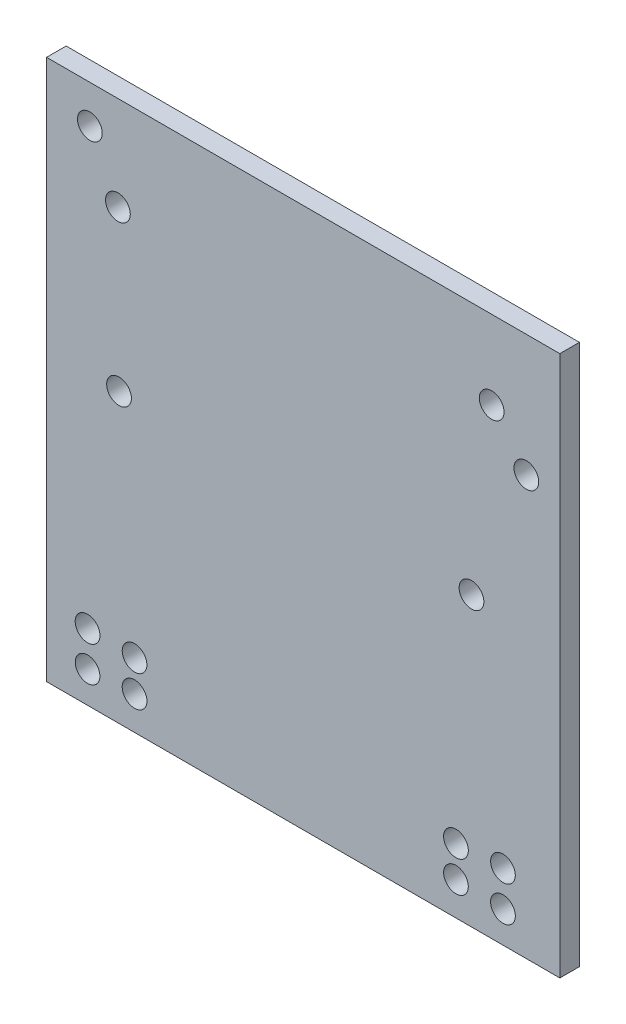
ISO-10303-21;
HEADER;
FILE_DESCRIPTION(('STEP AP214'),'2;1');
FILE_NAME('part.step','',(''),(''),'','','');
FILE_SCHEMA(('AUTOMOTIVE_DESIGN { 1 0 10303 214 1 1 1 1 }'));
ENDSEC;
DATA;
#1=APPLICATION_CONTEXT('core data for automotive mechanical design processes');
#2=APPLICATION_PROTOCOL_DEFINITION('international standard','automotive_design',2000,#1);
#3=PRODUCT_CONTEXT('',#1,'mechanical');
#4=PRODUCT('Part','Part','',(#3));
#5=PRODUCT_RELATED_PRODUCT_CATEGORY('part','',(#4));
#6=PRODUCT_DEFINITION_FORMATION('','',#4);
#7=PRODUCT_DEFINITION_CONTEXT('part definition',#1,'design');
#8=PRODUCT_DEFINITION('design','',#6,#7);
#9=PRODUCT_DEFINITION_SHAPE('','',#8);
#10=(LENGTH_UNIT() NAMED_UNIT(*) SI_UNIT(.MILLI.,.METRE.));
#11=(NAMED_UNIT(*) PLANE_ANGLE_UNIT() SI_UNIT($,.RADIAN.));
#12=(NAMED_UNIT(*) SI_UNIT($,.STERADIAN.) SOLID_ANGLE_UNIT());
#13=UNCERTAINTY_MEASURE_WITH_UNIT(LENGTH_MEASURE(1.E-05),#10,'distance_accuracy_value','');
#14=(GEOMETRIC_REPRESENTATION_CONTEXT(3) GLOBAL_UNCERTAINTY_ASSIGNED_CONTEXT((#13)) GLOBAL_UNIT_ASSIGNED_CONTEXT((#10,
#11,#12)) REPRESENTATION_CONTEXT('',''));
#15=CARTESIAN_POINT('',(0.,0.,0.));
#16=DIRECTION('',(0.,0.,1.));
#17=DIRECTION('',(1.,0.,0.));
#18=AXIS2_PLACEMENT_3D('',#15,#16,#17);
#19=CARTESIAN_POINT('',(0.,0.,-6.35));
#20=DIRECTION('',(0.,0.,1.));
#21=DIRECTION('',(-1.,0.,0.));
#22=AXIS2_PLACEMENT_3D('',#19,#20,#21);
#23=PLANE('',#22);
#24=CARTESIAN_POINT('',(-682.865800723062,218.063265585835,-6.35));
#25=DIRECTION('',(0.,0.,1.));
#26=DIRECTION('',(1.,0.,0.));
#27=AXIS2_PLACEMENT_3D('',#24,#25,#26);
#28=CIRCLE('',#27,4.00100000000008);
#29=CARTESIAN_POINT('',(-678.864800723062,218.063265585835,-6.35));
#30=VERTEX_POINT('',#29);
#31=EDGE_CURVE('E176',#30,#30,#28,.T.);
#32=ORIENTED_EDGE('',*,*,#31,.T.);
#33=EDGE_LOOP('',(#32));
#34=FACE_BOUND('',#33,.T.);
#35=CARTESIAN_POINT('',(-667.625800723062,228.858265585835,-6.35));
#36=DIRECTION('',(0.,0.,1.));
#37=DIRECTION('',(1.,0.,0.));
#38=AXIS2_PLACEMENT_3D('',#35,#36,#37);
#39=CIRCLE('',#38,4.00100000000008);
#40=CARTESIAN_POINT('',(-663.624800723062,228.858265585835,-6.35));
#41=VERTEX_POINT('',#40);
#42=EDGE_CURVE('E191',#41,#41,#39,.T.);
#43=ORIENTED_EDGE('',*,*,#42,.T.);
#44=EDGE_LOOP('',(#43));
#45=FACE_BOUND('',#44,.T.);
#46=CARTESIAN_POINT('',(-563.396926739587,218.698265585841,-6.35));
#47=DIRECTION('',(0.,0.,1.));
#48=DIRECTION('',(1.,0.,0.));
#49=AXIS2_PLACEMENT_3D('',#46,#47,#48);
#50=CIRCLE('',#49,4.00100000000008);
#51=CARTESIAN_POINT('',(-559.395926739586,218.698265585841,-6.35));
#52=VERTEX_POINT('',#51);
#53=EDGE_CURVE('E185',#52,#52,#50,.T.);
#54=ORIENTED_EDGE('',*,*,#53,.T.);
#55=EDGE_LOOP('',(#54));
#56=FACE_BOUND('',#55,.T.);
#57=CARTESIAN_POINT('',(-548.156926739587,229.493265585841,-6.35));
#58=DIRECTION('',(0.,0.,1.));
#59=DIRECTION('',(1.,0.,0.));
#60=AXIS2_PLACEMENT_3D('',#57,#58,#59);
#61=CIRCLE('',#60,4.00100000000008);
#62=CARTESIAN_POINT('',(-544.155926739586,229.493265585841,-6.35));
#63=VERTEX_POINT('',#62);
#64=EDGE_CURVE('E179',#63,#63,#61,.T.);
#65=ORIENTED_EDGE('',*,*,#64,.T.);
#66=EDGE_LOOP('',(#65));
#67=FACE_BOUND('',#66,.T.);
#68=DIRECTION('',(0.,1.,0.));
#69=VECTOR('',#68,1.);
#70=CARTESIAN_POINT('',(-529.711216697131,207.903265585856,-6.35));
#71=LINE('',#70,#69);
#72=CARTESIAN_POINT('',(-529.711216697131,207.903265585856,-6.35));
#73=VERTEX_POINT('',#72);
#74=CARTESIAN_POINT('',(-529.711216697131,383.2533201506,-6.35));
#75=VERTEX_POINT('',#74);
#76=EDGE_CURVE('E99',#73,#75,#71,.T.);
#77=ORIENTED_EDGE('',*,*,#76,.F.);
#78=DIRECTION('',(1.,0.,0.));
#79=VECTOR('',#78,1.);
#80=CARTESIAN_POINT('',(-696.157504886553,207.903265585856,-6.35));
#81=LINE('',#80,#79);
#82=CARTESIAN_POINT('',(-696.157504886553,207.903265585856,-6.35));
#83=VERTEX_POINT('',#82);
#84=EDGE_CURVE('E102',#83,#73,#81,.T.);
#85=ORIENTED_EDGE('',*,*,#84,.F.);
#86=DIRECTION('',(0.,-1.,0.));
#87=VECTOR('',#86,1.);
#88=CARTESIAN_POINT('',(-696.157504886553,207.903265585856,-6.35));
#89=LINE('',#88,#87);
#90=CARTESIAN_POINT('',(-696.157504886553,383.2533201506,-6.35));
#91=VERTEX_POINT('',#90);
#92=EDGE_CURVE('E90',#91,#83,#89,.T.);
#93=ORIENTED_EDGE('',*,*,#92,.F.);
#94=DIRECTION('',(-1.,0.,0.));
#95=VECTOR('',#94,1.);
#96=CARTESIAN_POINT('',(-696.157504886553,383.2533201506,-6.35));
#97=LINE('',#96,#95);
#98=EDGE_CURVE('E95',#75,#91,#97,.T.);
#99=ORIENTED_EDGE('',*,*,#98,.F.);
#100=EDGE_LOOP('',(#77,#85,#93,#99));
#101=FACE_BOUND('',#100,.T.);
#102=CARTESIAN_POINT('',(-667.625800723058,218.698265585856,-6.35));
#103=DIRECTION('',(0.,0.,1.));
#104=DIRECTION('',(1.,0.,0.));
#105=AXIS2_PLACEMENT_3D('',#102,#103,#104);
#106=CIRCLE('',#105,4.01269999999997);
#107=CARTESIAN_POINT('',(-663.613100723058,218.698265585856,-6.35));
#108=VERTEX_POINT('',#107);
#109=EDGE_CURVE('E111',#108,#108,#106,.T.);
#110=ORIENTED_EDGE('',*,*,#109,.T.);
#111=EDGE_LOOP('',(#110));
#112=FACE_BOUND('',#111,.T.);
#113=CARTESIAN_POINT('',(-682.865800723058,229.493265585856,-6.35));
#114=DIRECTION('',(0.,0.,1.));
#115=DIRECTION('',(1.,0.,0.));
#116=AXIS2_PLACEMENT_3D('',#113,#114,#115);
#117=CIRCLE('',#116,4.01269999999997);
#118=CARTESIAN_POINT('',(-678.853100723058,229.493265585856,-6.35));
#119=VERTEX_POINT('',#118);
#120=EDGE_CURVE('E122',#119,#119,#117,.T.);
#121=ORIENTED_EDGE('',*,*,#120,.T.);
#122=EDGE_LOOP('',(#121));
#123=FACE_BOUND('',#122,.T.);
#124=CARTESIAN_POINT('',(-682.121778023771,370.932816424034,-6.35));
#125=DIRECTION('',(0.,0.,1.));
#126=DIRECTION('',(1.,0.,0.));
#127=AXIS2_PLACEMENT_3D('',#124,#125,#126);
#128=CIRCLE('',#127,4.01270000000008);
#129=CARTESIAN_POINT('',(-678.109078023771,370.932816424034,-6.35));
#130=VERTEX_POINT('',#129);
#131=EDGE_CURVE('E128',#130,#130,#128,.T.);
#132=ORIENTED_EDGE('',*,*,#131,.T.);
#133=EDGE_LOOP('',(#132));
#134=FACE_BOUND('',#133,.T.);
#135=CARTESIAN_POINT('',(-673.025414387742,352.751458014907,-6.35));
#136=DIRECTION('',(0.,0.,1.));
#137=DIRECTION('',(1.,0.,0.));
#138=AXIS2_PLACEMENT_3D('',#135,#136,#137);
#139=CIRCLE('',#138,4.01270000000008);
#140=CARTESIAN_POINT('',(-669.012714387742,352.751458014907,-6.35));
#141=VERTEX_POINT('',#140);
#142=EDGE_CURVE('E134',#141,#141,#139,.T.);
#143=ORIENTED_EDGE('',*,*,#142,.T.);
#144=EDGE_LOOP('',(#143));
#145=FACE_BOUND('',#144,.T.);
#146=CARTESIAN_POINT('',(-551.816021725944,357.766762234083,-6.35));
#147=DIRECTION('',(0.,0.,1.));
#148=DIRECTION('',(1.,0.,0.));
#149=AXIS2_PLACEMENT_3D('',#146,#147,#148);
#150=CIRCLE('',#149,4.01270000000008);
#151=CARTESIAN_POINT('',(-547.803321725944,357.766762234083,-6.35));
#152=VERTEX_POINT('',#151);
#153=EDGE_CURVE('E140',#152,#152,#150,.T.);
#154=ORIENTED_EDGE('',*,*,#153,.T.);
#155=EDGE_LOOP('',(#154));
#156=FACE_BOUND('',#155,.T.);
#157=CARTESIAN_POINT('',(-540.572963717979,343.760561941729,-6.35));
#158=DIRECTION('',(0.,0.,1.));
#159=DIRECTION('',(1.,0.,0.));
#160=AXIS2_PLACEMENT_3D('',#157,#158,#159);
#161=CIRCLE('',#160,4.01270000000008);
#162=CARTESIAN_POINT('',(-536.560263717979,343.760561941729,-6.35));
#163=VERTEX_POINT('',#162);
#164=EDGE_CURVE('E146',#163,#163,#161,.T.);
#165=ORIENTED_EDGE('',*,*,#164,.T.);
#166=EDGE_LOOP('',(#165));
#167=FACE_BOUND('',#166,.T.);
#168=CARTESIAN_POINT('',(-548.156926739575,218.063265585856,-6.35));
#169=DIRECTION('',(0.,0.,1.));
#170=DIRECTION('',(1.,0.,0.));
#171=AXIS2_PLACEMENT_3D('',#168,#169,#170);
#172=CIRCLE('',#171,4.01270000000008);
#173=CARTESIAN_POINT('',(-544.144226739575,218.063265585856,-6.35));
#174=VERTEX_POINT('',#173);
#175=EDGE_CURVE('E152',#174,#174,#172,.T.);
#176=ORIENTED_EDGE('',*,*,#175,.T.);
#177=EDGE_LOOP('',(#176));
#178=FACE_BOUND('',#177,.T.);
#179=CARTESIAN_POINT('',(-563.396926739575,228.858265585856,-6.35));
#180=DIRECTION('',(0.,0.,1.));
#181=DIRECTION('',(1.,0.,0.));
#182=AXIS2_PLACEMENT_3D('',#179,#180,#181);
#183=CIRCLE('',#182,4.01270000000008);
#184=CARTESIAN_POINT('',(-559.384226739575,228.858265585856,-6.35));
#185=VERTEX_POINT('',#184);
#186=EDGE_CURVE('E158',#185,#185,#183,.T.);
#187=ORIENTED_EDGE('',*,*,#186,.T.);
#188=EDGE_LOOP('',(#187));
#189=FACE_BOUND('',#188,.T.);
#190=CARTESIAN_POINT('',(-558.361573731319,301.206157993896,-6.35));
#191=DIRECTION('',(0.,0.,1.));
#192=DIRECTION('',(1.,0.,0.));
#193=AXIS2_PLACEMENT_3D('',#190,#191,#192);
#194=CIRCLE('',#193,4.01320000000002);
#195=CARTESIAN_POINT('',(-554.348373731319,301.206157993896,-6.35));
#196=VERTEX_POINT('',#195);
#197=EDGE_CURVE('E164',#196,#196,#194,.T.);
#198=ORIENTED_EDGE('',*,*,#197,.T.);
#199=EDGE_LOOP('',(#198));
#200=FACE_BOUND('',#199,.T.);
#201=CARTESIAN_POINT('',(-672.661153731319,301.206157993896,-6.35));
#202=DIRECTION('',(0.,0.,1.));
#203=DIRECTION('',(1.,0.,0.));
#204=AXIS2_PLACEMENT_3D('',#201,#202,#203);
#205=CIRCLE('',#204,4.01320000000002);
#206=CARTESIAN_POINT('',(-668.647953731319,301.206157993896,-6.35));
#207=VERTEX_POINT('',#206);
#208=EDGE_CURVE('E170',#207,#207,#205,.T.);
#209=ORIENTED_EDGE('',*,*,#208,.T.);
#210=EDGE_LOOP('',(#209));
#211=FACE_BOUND('',#210,.T.);
#212=ADVANCED_FACE('F43',(#34,#45,#56,#67,#101,#112,#123,#134,#145,#156,#167,#178,#189,#200,
#211),#23,.F.);
#213=CARTESIAN_POINT('',(0.,0.,0.));
#214=DIRECTION('',(0.,0.,1.));
#215=DIRECTION('',(-1.,0.,0.));
#216=AXIS2_PLACEMENT_3D('',#213,#214,#215);
#217=PLANE('',#216);
#218=CARTESIAN_POINT('',(-682.865800723062,218.063265585835,0.));
#219=DIRECTION('',(0.,0.,1.));
#220=DIRECTION('',(1.,0.,0.));
#221=AXIS2_PLACEMENT_3D('',#218,#219,#220);
#222=CIRCLE('',#221,4.00100000000008);
#223=CARTESIAN_POINT('',(-678.864800723062,218.063265585835,0.));
#224=VERTEX_POINT('',#223);
#225=EDGE_CURVE('E197',#224,#224,#222,.T.);
#226=ORIENTED_EDGE('',*,*,#225,.F.);
#227=EDGE_LOOP('',(#226));
#228=FACE_BOUND('',#227,.T.);
#229=CARTESIAN_POINT('',(-667.625800723062,228.858265585835,0.));
#230=DIRECTION('',(0.,0.,1.));
#231=DIRECTION('',(1.,0.,0.));
#232=AXIS2_PLACEMENT_3D('',#229,#230,#231);
#233=CIRCLE('',#232,4.00100000000008);
#234=CARTESIAN_POINT('',(-663.624800723062,228.858265585835,0.));
#235=VERTEX_POINT('',#234);
#236=EDGE_CURVE('E194',#235,#235,#233,.T.);
#237=ORIENTED_EDGE('',*,*,#236,.F.);
#238=EDGE_LOOP('',(#237));
#239=FACE_BOUND('',#238,.T.);
#240=CARTESIAN_POINT('',(-563.396926739587,218.698265585841,0.));
#241=DIRECTION('',(0.,0.,1.));
#242=DIRECTION('',(1.,0.,0.));
#243=AXIS2_PLACEMENT_3D('',#240,#241,#242);
#244=CIRCLE('',#243,4.00100000000008);
#245=CARTESIAN_POINT('',(-559.395926739586,218.698265585841,0.));
#246=VERTEX_POINT('',#245);
#247=EDGE_CURVE('E188',#246,#246,#244,.T.);
#248=ORIENTED_EDGE('',*,*,#247,.F.);
#249=EDGE_LOOP('',(#248));
#250=FACE_BOUND('',#249,.T.);
#251=CARTESIAN_POINT('',(-548.156926739587,229.493265585841,0.));
#252=DIRECTION('',(0.,0.,1.));
#253=DIRECTION('',(1.,0.,0.));
#254=AXIS2_PLACEMENT_3D('',#251,#252,#253);
#255=CIRCLE('',#254,4.00100000000008);
#256=CARTESIAN_POINT('',(-544.155926739586,229.493265585841,0.));
#257=VERTEX_POINT('',#256);
#258=EDGE_CURVE('E182',#257,#257,#255,.T.);
#259=ORIENTED_EDGE('',*,*,#258,.F.);
#260=EDGE_LOOP('',(#259));
#261=FACE_BOUND('',#260,.T.);
#262=CARTESIAN_POINT('',(-558.361573731319,301.206157993896,0.));
#263=DIRECTION('',(0.,0.,1.));
#264=DIRECTION('',(1.,0.,0.));
#265=AXIS2_PLACEMENT_3D('',#262,#263,#264);
#266=CIRCLE('',#265,4.01320000000002);
#267=CARTESIAN_POINT('',(-554.348373731319,301.206157993896,0.));
#268=VERTEX_POINT('',#267);
#269=EDGE_CURVE('E167',#268,#268,#266,.T.);
#270=ORIENTED_EDGE('',*,*,#269,.F.);
#271=EDGE_LOOP('',(#270));
#272=FACE_BOUND('',#271,.T.);
#273=CARTESIAN_POINT('',(-548.156926739575,218.063265585856,0.));
#274=DIRECTION('',(0.,0.,1.));
#275=DIRECTION('',(1.,0.,0.));
#276=AXIS2_PLACEMENT_3D('',#273,#274,#275);
#277=CIRCLE('',#276,4.01270000000008);
#278=CARTESIAN_POINT('',(-544.144226739575,218.063265585856,0.));
#279=VERTEX_POINT('',#278);
#280=EDGE_CURVE('E155',#279,#279,#277,.T.);
#281=ORIENTED_EDGE('',*,*,#280,.F.);
#282=EDGE_LOOP('',(#281));
#283=FACE_BOUND('',#282,.T.);
#284=CARTESIAN_POINT('',(-551.816021725944,357.766762234083,0.));
#285=DIRECTION('',(0.,0.,1.));
#286=DIRECTION('',(1.,0.,0.));
#287=AXIS2_PLACEMENT_3D('',#284,#285,#286);
#288=CIRCLE('',#287,4.01270000000008);
#289=CARTESIAN_POINT('',(-547.803321725944,357.766762234083,0.));
#290=VERTEX_POINT('',#289);
#291=EDGE_CURVE('E143',#290,#290,#288,.T.);
#292=ORIENTED_EDGE('',*,*,#291,.F.);
#293=EDGE_LOOP('',(#292));
#294=FACE_BOUND('',#293,.T.);
#295=CARTESIAN_POINT('',(-682.121778023771,370.932816424034,0.));
#296=DIRECTION('',(0.,0.,1.));
#297=DIRECTION('',(1.,0.,0.));
#298=AXIS2_PLACEMENT_3D('',#295,#296,#297);
#299=CIRCLE('',#298,4.01270000000008);
#300=CARTESIAN_POINT('',(-678.109078023771,370.932816424034,0.));
#301=VERTEX_POINT('',#300);
#302=EDGE_CURVE('E131',#301,#301,#299,.T.);
#303=ORIENTED_EDGE('',*,*,#302,.F.);
#304=EDGE_LOOP('',(#303));
#305=FACE_BOUND('',#304,.T.);
#306=CARTESIAN_POINT('',(-667.625800723058,218.698265585856,0.));
#307=DIRECTION('',(0.,0.,1.));
#308=DIRECTION('',(1.,0.,0.));
#309=AXIS2_PLACEMENT_3D('',#306,#307,#308);
#310=CIRCLE('',#309,4.01269999999997);
#311=CARTESIAN_POINT('',(-663.613100723058,218.698265585856,0.));
#312=VERTEX_POINT('',#311);
#313=EDGE_CURVE('E119',#312,#312,#310,.T.);
#314=ORIENTED_EDGE('',*,*,#313,.F.);
#315=EDGE_LOOP('',(#314));
#316=FACE_BOUND('',#315,.T.);
#317=DIRECTION('',(0.,1.,0.));
#318=VECTOR('',#317,1.);
#319=CARTESIAN_POINT('',(-529.711216697131,207.903265585856,0.));
#320=LINE('',#319,#318);
#321=CARTESIAN_POINT('',(-529.711216697131,207.903265585856,0.));
#322=VERTEX_POINT('',#321);
#323=CARTESIAN_POINT('',(-529.711216697131,383.2533201506,0.));
#324=VERTEX_POINT('',#323);
#325=EDGE_CURVE('E107',#322,#324,#320,.T.);
#326=ORIENTED_EDGE('',*,*,#325,.T.);
#327=DIRECTION('',(-1.,0.,0.));
#328=VECTOR('',#327,1.);
#329=CARTESIAN_POINT('',(-696.157504886553,383.2533201506,0.));
#330=LINE('',#329,#328);
#331=CARTESIAN_POINT('',(-696.157504886553,383.2533201506,0.));
#332=VERTEX_POINT('',#331);
#333=EDGE_CURVE('E110',#324,#332,#330,.T.);
#334=ORIENTED_EDGE('',*,*,#333,.T.);
#335=DIRECTION('',(0.,-1.,0.));
#336=VECTOR('',#335,1.);
#337=CARTESIAN_POINT('',(-696.157504886553,207.903265585856,0.));
#338=LINE('',#337,#336);
#339=CARTESIAN_POINT('',(-696.157504886553,207.903265585856,0.));
#340=VERTEX_POINT('',#339);
#341=EDGE_CURVE('E93',#332,#340,#338,.T.);
#342=ORIENTED_EDGE('',*,*,#341,.T.);
#343=DIRECTION('',(1.,0.,0.));
#344=VECTOR('',#343,1.);
#345=CARTESIAN_POINT('',(-696.157504886553,207.903265585856,0.));
#346=LINE('',#345,#344);
#347=EDGE_CURVE('E114',#340,#322,#346,.T.);
#348=ORIENTED_EDGE('',*,*,#347,.T.);
#349=EDGE_LOOP('',(#326,#334,#342,#348));
#350=FACE_BOUND('',#349,.T.);
#351=CARTESIAN_POINT('',(-682.865800723058,229.493265585856,0.));
#352=DIRECTION('',(0.,0.,1.));
#353=DIRECTION('',(1.,0.,0.));
#354=AXIS2_PLACEMENT_3D('',#351,#352,#353);
#355=CIRCLE('',#354,4.01269999999997);
#356=CARTESIAN_POINT('',(-678.853100723058,229.493265585856,0.));
#357=VERTEX_POINT('',#356);
#358=EDGE_CURVE('E125',#357,#357,#355,.T.);
#359=ORIENTED_EDGE('',*,*,#358,.F.);
#360=EDGE_LOOP('',(#359));
#361=FACE_BOUND('',#360,.T.);
#362=CARTESIAN_POINT('',(-673.025414387742,352.751458014907,0.));
#363=DIRECTION('',(0.,0.,1.));
#364=DIRECTION('',(1.,0.,0.));
#365=AXIS2_PLACEMENT_3D('',#362,#363,#364);
#366=CIRCLE('',#365,4.01270000000008);
#367=CARTESIAN_POINT('',(-669.012714387742,352.751458014907,0.));
#368=VERTEX_POINT('',#367);
#369=EDGE_CURVE('E137',#368,#368,#366,.T.);
#370=ORIENTED_EDGE('',*,*,#369,.F.);
#371=EDGE_LOOP('',(#370));
#372=FACE_BOUND('',#371,.T.);
#373=CARTESIAN_POINT('',(-540.572963717979,343.760561941729,0.));
#374=DIRECTION('',(0.,0.,1.));
#375=DIRECTION('',(1.,0.,0.));
#376=AXIS2_PLACEMENT_3D('',#373,#374,#375);
#377=CIRCLE('',#376,4.01270000000008);
#378=CARTESIAN_POINT('',(-536.560263717979,343.760561941729,0.));
#379=VERTEX_POINT('',#378);
#380=EDGE_CURVE('E149',#379,#379,#377,.T.);
#381=ORIENTED_EDGE('',*,*,#380,.F.);
#382=EDGE_LOOP('',(#381));
#383=FACE_BOUND('',#382,.T.);
#384=CARTESIAN_POINT('',(-563.396926739575,228.858265585856,0.));
#385=DIRECTION('',(0.,0.,1.));
#386=DIRECTION('',(1.,0.,0.));
#387=AXIS2_PLACEMENT_3D('',#384,#385,#386);
#388=CIRCLE('',#387,4.01270000000008);
#389=CARTESIAN_POINT('',(-559.384226739575,228.858265585856,0.));
#390=VERTEX_POINT('',#389);
#391=EDGE_CURVE('E161',#390,#390,#388,.T.);
#392=ORIENTED_EDGE('',*,*,#391,.F.);
#393=EDGE_LOOP('',(#392));
#394=FACE_BOUND('',#393,.T.);
#395=CARTESIAN_POINT('',(-672.661153731319,301.206157993896,0.));
#396=DIRECTION('',(0.,0.,1.));
#397=DIRECTION('',(1.,0.,0.));
#398=AXIS2_PLACEMENT_3D('',#395,#396,#397);
#399=CIRCLE('',#398,4.01320000000002);
#400=CARTESIAN_POINT('',(-668.647953731319,301.206157993896,0.));
#401=VERTEX_POINT('',#400);
#402=EDGE_CURVE('E173',#401,#401,#399,.T.);
#403=ORIENTED_EDGE('',*,*,#402,.F.);
#404=EDGE_LOOP('',(#403));
#405=FACE_BOUND('',#404,.T.);
#406=ADVANCED_FACE('F212',(#228,#239,#250,#261,#272,#283,#294,#305,#316,#350,#361,#372,#383,
#394,#405),#217,.T.);
#407=CARTESIAN_POINT('',(-529.711216697131,207.903265585856,-6.35));
#408=DIRECTION('',(-1.,0.,0.));
#409=DIRECTION('',(0.,0.,-1.));
#410=AXIS2_PLACEMENT_3D('',#407,#408,#409);
#411=PLANE('',#410);
#412=ORIENTED_EDGE('',*,*,#325,.F.);
#413=DIRECTION('',(0.,0.,1.));
#414=VECTOR('',#413,1.);
#415=CARTESIAN_POINT('',(-529.711216697131,207.903265585856,-6.35));
#416=LINE('',#415,#414);
#417=EDGE_CURVE('E60',#73,#322,#416,.T.);
#418=ORIENTED_EDGE('',*,*,#417,.F.);
#419=ORIENTED_EDGE('',*,*,#76,.T.);
#420=DIRECTION('',(0.,0.,1.));
#421=VECTOR('',#420,1.);
#422=CARTESIAN_POINT('',(-529.711216697131,383.2533201506,-6.35));
#423=LINE('',#422,#421);
#424=EDGE_CURVE('E11',#75,#324,#423,.T.);
#425=ORIENTED_EDGE('',*,*,#424,.T.);
#426=EDGE_LOOP('',(#412,#418,#419,#425));
#427=FACE_BOUND('',#426,.T.);
#428=ADVANCED_FACE('F45',(#427),#411,.F.);
#429=CARTESIAN_POINT('',(-696.157504886553,383.2533201506,-6.35));
#430=DIRECTION('',(0.,-1.,0.));
#431=DIRECTION('',(0.,0.,1.));
#432=AXIS2_PLACEMENT_3D('',#429,#430,#431);
#433=PLANE('',#432);
#434=ORIENTED_EDGE('',*,*,#333,.F.);
#435=ORIENTED_EDGE('',*,*,#424,.F.);
#436=ORIENTED_EDGE('',*,*,#98,.T.);
#437=DIRECTION('',(0.,0.,1.));
#438=VECTOR('',#437,1.);
#439=CARTESIAN_POINT('',(-696.157504886553,383.2533201506,-6.35));
#440=LINE('',#439,#438);
#441=EDGE_CURVE('E52',#91,#332,#440,.T.);
#442=ORIENTED_EDGE('',*,*,#441,.T.);
#443=EDGE_LOOP('',(#434,#435,#436,#442));
#444=FACE_BOUND('',#443,.T.);
#445=ADVANCED_FACE('F96',(#444),#433,.F.);
#446=CARTESIAN_POINT('',(-696.157504886553,207.903265585856,-6.35));
#447=DIRECTION('',(1.,0.,0.));
#448=DIRECTION('',(0.,0.,1.));
#449=AXIS2_PLACEMENT_3D('',#446,#447,#448);
#450=PLANE('',#449);
#451=ORIENTED_EDGE('',*,*,#341,.F.);
#452=ORIENTED_EDGE('',*,*,#441,.F.);
#453=ORIENTED_EDGE('',*,*,#92,.T.);
#454=DIRECTION('',(0.,0.,1.));
#455=VECTOR('',#454,1.);
#456=CARTESIAN_POINT('',(-696.157504886553,207.903265585856,-6.35));
#457=LINE('',#456,#455);
#458=EDGE_CURVE('E76',#83,#340,#457,.T.);
#459=ORIENTED_EDGE('',*,*,#458,.T.);
#460=EDGE_LOOP('',(#451,#452,#453,#459));
#461=FACE_BOUND('',#460,.T.);
#462=ADVANCED_FACE('F88',(#461),#450,.F.);
#463=CARTESIAN_POINT('',(-696.157504886553,207.903265585856,-6.35));
#464=DIRECTION('',(0.,1.,0.));
#465=DIRECTION('',(0.,0.,-1.));
#466=AXIS2_PLACEMENT_3D('',#463,#464,#465);
#467=PLANE('',#466);
#468=ORIENTED_EDGE('',*,*,#347,.F.);
#469=ORIENTED_EDGE('',*,*,#458,.F.);
#470=ORIENTED_EDGE('',*,*,#84,.T.);
#471=ORIENTED_EDGE('',*,*,#417,.T.);
#472=EDGE_LOOP('',(#468,#469,#470,#471));
#473=FACE_BOUND('',#472,.T.);
#474=ADVANCED_FACE('F267',(#473),#467,.F.);
#475=CARTESIAN_POINT('',(-667.625800723058,218.698265585856,-6.35));
#476=DIRECTION('',(0.,0.,1.));
#477=DIRECTION('',(-1.,0.,0.));
#478=AXIS2_PLACEMENT_3D('',#475,#476,#477);
#479=CYLINDRICAL_SURFACE('',#478,4.01269999999997);
#480=ORIENTED_EDGE('',*,*,#109,.F.);
#481=EDGE_LOOP('',(#480));
#482=FACE_BOUND('',#481,.T.);
#483=ORIENTED_EDGE('',*,*,#313,.T.);
#484=EDGE_LOOP('',(#483));
#485=FACE_BOUND('',#484,.T.);
#486=ADVANCED_FACE('F264',(#482,#485),#479,.F.);
#487=CARTESIAN_POINT('',(-682.865800723058,229.493265585856,-6.35));
#488=DIRECTION('',(0.,0.,1.));
#489=DIRECTION('',(-1.,0.,0.));
#490=AXIS2_PLACEMENT_3D('',#487,#488,#489);
#491=CYLINDRICAL_SURFACE('',#490,4.01269999999997);
#492=ORIENTED_EDGE('',*,*,#120,.F.);
#493=EDGE_LOOP('',(#492));
#494=FACE_BOUND('',#493,.T.);
#495=ORIENTED_EDGE('',*,*,#358,.T.);
#496=EDGE_LOOP('',(#495));
#497=FACE_BOUND('',#496,.T.);
#498=ADVANCED_FACE('F307',(#494,#497),#491,.F.);
#499=CARTESIAN_POINT('',(-682.121778023771,370.932816424034,-6.35));
#500=DIRECTION('',(0.,0.,1.));
#501=DIRECTION('',(-1.,0.,0.));
#502=AXIS2_PLACEMENT_3D('',#499,#500,#501);
#503=CYLINDRICAL_SURFACE('',#502,4.01270000000008);
#504=ORIENTED_EDGE('',*,*,#131,.F.);
#505=EDGE_LOOP('',(#504));
#506=FACE_BOUND('',#505,.T.);
#507=ORIENTED_EDGE('',*,*,#302,.T.);
#508=EDGE_LOOP('',(#507));
#509=FACE_BOUND('',#508,.T.);
#510=ADVANCED_FACE('F316',(#506,#509),#503,.F.);
#511=CARTESIAN_POINT('',(-673.025414387742,352.751458014907,-6.35));
#512=DIRECTION('',(0.,0.,1.));
#513=DIRECTION('',(-1.,0.,0.));
#514=AXIS2_PLACEMENT_3D('',#511,#512,#513);
#515=CYLINDRICAL_SURFACE('',#514,4.01270000000008);
#516=ORIENTED_EDGE('',*,*,#142,.F.);
#517=EDGE_LOOP('',(#516));
#518=FACE_BOUND('',#517,.T.);
#519=ORIENTED_EDGE('',*,*,#369,.T.);
#520=EDGE_LOOP('',(#519));
#521=FACE_BOUND('',#520,.T.);
#522=ADVANCED_FACE('F325',(#518,#521),#515,.F.);
#523=CARTESIAN_POINT('',(-551.816021725944,357.766762234083,-6.35));
#524=DIRECTION('',(0.,0.,1.));
#525=DIRECTION('',(-1.,0.,0.));
#526=AXIS2_PLACEMENT_3D('',#523,#524,#525);
#527=CYLINDRICAL_SURFACE('',#526,4.01270000000008);
#528=ORIENTED_EDGE('',*,*,#153,.F.);
#529=EDGE_LOOP('',(#528));
#530=FACE_BOUND('',#529,.T.);
#531=ORIENTED_EDGE('',*,*,#291,.T.);
#532=EDGE_LOOP('',(#531));
#533=FACE_BOUND('',#532,.T.);
#534=ADVANCED_FACE('F335',(#530,#533),#527,.F.);
#535=CARTESIAN_POINT('',(-540.572963717979,343.760561941729,-6.35));
#536=DIRECTION('',(0.,0.,1.));
#537=DIRECTION('',(-1.,0.,0.));
#538=AXIS2_PLACEMENT_3D('',#535,#536,#537);
#539=CYLINDRICAL_SURFACE('',#538,4.01270000000008);
#540=ORIENTED_EDGE('',*,*,#164,.F.);
#541=EDGE_LOOP('',(#540));
#542=FACE_BOUND('',#541,.T.);
#543=ORIENTED_EDGE('',*,*,#380,.T.);
#544=EDGE_LOOP('',(#543));
#545=FACE_BOUND('',#544,.T.);
#546=ADVANCED_FACE('F345',(#542,#545),#539,.F.);
#547=CARTESIAN_POINT('',(-548.156926739575,218.063265585856,-6.35));
#548=DIRECTION('',(0.,0.,1.));
#549=DIRECTION('',(-1.,0.,0.));
#550=AXIS2_PLACEMENT_3D('',#547,#548,#549);
#551=CYLINDRICAL_SURFACE('',#550,4.01270000000008);
#552=ORIENTED_EDGE('',*,*,#175,.F.);
#553=EDGE_LOOP('',(#552));
#554=FACE_BOUND('',#553,.T.);
#555=ORIENTED_EDGE('',*,*,#280,.T.);
#556=EDGE_LOOP('',(#555));
#557=FACE_BOUND('',#556,.T.);
#558=ADVANCED_FACE('F355',(#554,#557),#551,.F.);
#559=CARTESIAN_POINT('',(-563.396926739575,228.858265585856,-6.35));
#560=DIRECTION('',(0.,0.,1.));
#561=DIRECTION('',(-1.,0.,0.));
#562=AXIS2_PLACEMENT_3D('',#559,#560,#561);
#563=CYLINDRICAL_SURFACE('',#562,4.01270000000008);
#564=ORIENTED_EDGE('',*,*,#186,.F.);
#565=EDGE_LOOP('',(#564));
#566=FACE_BOUND('',#565,.T.);
#567=ORIENTED_EDGE('',*,*,#391,.T.);
#568=EDGE_LOOP('',(#567));
#569=FACE_BOUND('',#568,.T.);
#570=ADVANCED_FACE('F256',(#566,#569),#563,.F.);
#571=CARTESIAN_POINT('',(-558.361573731319,301.206157993896,-6.35));
#572=DIRECTION('',(0.,0.,1.));
#573=DIRECTION('',(-1.,0.,0.));
#574=AXIS2_PLACEMENT_3D('',#571,#572,#573);
#575=CYLINDRICAL_SURFACE('',#574,4.01320000000002);
#576=ORIENTED_EDGE('',*,*,#197,.F.);
#577=EDGE_LOOP('',(#576));
#578=FACE_BOUND('',#577,.T.);
#579=ORIENTED_EDGE('',*,*,#269,.T.);
#580=EDGE_LOOP('',(#579));
#581=FACE_BOUND('',#580,.T.);
#582=ADVANCED_FACE('F245',(#578,#581),#575,.F.);
#583=CARTESIAN_POINT('',(-672.661153731319,301.206157993896,-6.35));
#584=DIRECTION('',(0.,0.,1.));
#585=DIRECTION('',(-1.,0.,0.));
#586=AXIS2_PLACEMENT_3D('',#583,#584,#585);
#587=CYLINDRICAL_SURFACE('',#586,4.01320000000002);
#588=ORIENTED_EDGE('',*,*,#208,.F.);
#589=EDGE_LOOP('',(#588));
#590=FACE_BOUND('',#589,.T.);
#591=ORIENTED_EDGE('',*,*,#402,.T.);
#592=EDGE_LOOP('',(#591));
#593=FACE_BOUND('',#592,.T.);
#594=ADVANCED_FACE('F242',(#590,#593),#587,.F.);
#595=CARTESIAN_POINT('',(-548.156926739587,229.493265585841,-6.35));
#596=DIRECTION('',(0.,0.,1.));
#597=DIRECTION('',(1.,0.,0.));
#598=AXIS2_PLACEMENT_3D('',#595,#596,#597);
#599=CYLINDRICAL_SURFACE('',#598,4.00100000000008);
#600=ORIENTED_EDGE('',*,*,#64,.F.);
#601=EDGE_LOOP('',(#600));
#602=FACE_BOUND('',#601,.T.);
#603=ORIENTED_EDGE('',*,*,#258,.T.);
#604=EDGE_LOOP('',(#603));
#605=FACE_BOUND('',#604,.T.);
#606=ADVANCED_FACE('F244',(#602,#605),#599,.F.);
#607=CARTESIAN_POINT('',(-563.396926739587,218.698265585841,-6.35));
#608=DIRECTION('',(0.,0.,1.));
#609=DIRECTION('',(1.,0.,0.));
#610=AXIS2_PLACEMENT_3D('',#607,#608,#609);
#611=CYLINDRICAL_SURFACE('',#610,4.00100000000008);
#612=ORIENTED_EDGE('',*,*,#53,.F.);
#613=EDGE_LOOP('',(#612));
#614=FACE_BOUND('',#613,.T.);
#615=ORIENTED_EDGE('',*,*,#247,.T.);
#616=EDGE_LOOP('',(#615));
#617=FACE_BOUND('',#616,.T.);
#618=ADVANCED_FACE('F253',(#614,#617),#611,.F.);
#619=CARTESIAN_POINT('',(-667.625800723062,228.858265585835,-6.35));
#620=DIRECTION('',(0.,0.,1.));
#621=DIRECTION('',(1.,0.,0.));
#622=AXIS2_PLACEMENT_3D('',#619,#620,#621);
#623=CYLINDRICAL_SURFACE('',#622,4.00100000000008);
#624=ORIENTED_EDGE('',*,*,#42,.F.);
#625=EDGE_LOOP('',(#624));
#626=FACE_BOUND('',#625,.T.);
#627=ORIENTED_EDGE('',*,*,#236,.T.);
#628=EDGE_LOOP('',(#627));
#629=FACE_BOUND('',#628,.T.);
#630=ADVANCED_FACE('F208',(#626,#629),#623,.F.);
#631=CARTESIAN_POINT('',(-682.865800723062,218.063265585835,-6.35));
#632=DIRECTION('',(0.,0.,1.));
#633=DIRECTION('',(1.,0.,0.));
#634=AXIS2_PLACEMENT_3D('',#631,#632,#633);
#635=CYLINDRICAL_SURFACE('',#634,4.00100000000008);
#636=ORIENTED_EDGE('',*,*,#31,.F.);
#637=EDGE_LOOP('',(#636));
#638=FACE_BOUND('',#637,.T.);
#639=ORIENTED_EDGE('',*,*,#225,.T.);
#640=EDGE_LOOP('',(#639));
#641=FACE_BOUND('',#640,.T.);
#642=ADVANCED_FACE('F205',(#638,#641),#635,.F.);
#643=CLOSED_SHELL('',(#212,#406,#428,#445,#462,#474,#486,#498,#510,#522,#534,#546,#558,#570,
#582,#594,#606,#618,#630,#642));
#644=MANIFOLD_SOLID_BREP('B2',#643);
#645=ADVANCED_BREP_SHAPE_REPRESENTATION('',(#18,#644),#14);
#646=SHAPE_DEFINITION_REPRESENTATION(#9,#645);
ENDSEC;
END-ISO-10303-21;
